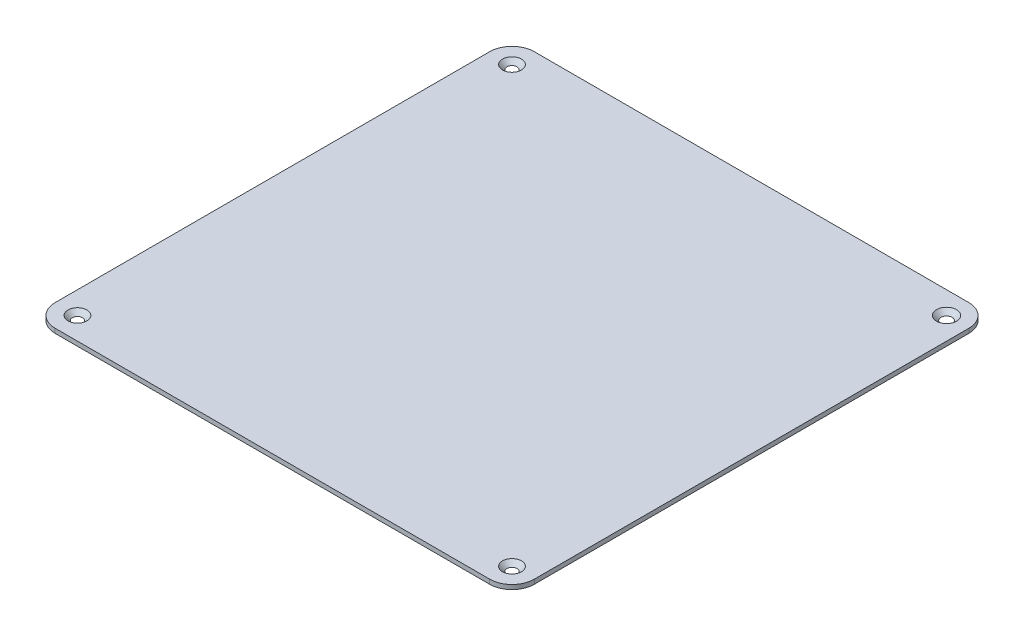
ISO-10303-21;
HEADER;
FILE_DESCRIPTION(('STEP AP214'),'2;1');
FILE_NAME('part.step','',(''),(''),'','','');
FILE_SCHEMA(('AUTOMOTIVE_DESIGN { 1 0 10303 214 1 1 1 1 }'));
ENDSEC;
DATA;
#1=APPLICATION_CONTEXT('core data for automotive mechanical design processes');
#2=APPLICATION_PROTOCOL_DEFINITION('international standard','automotive_design',2000,#1);
#3=PRODUCT_CONTEXT('',#1,'mechanical');
#4=PRODUCT('Part','Part','',(#3));
#5=PRODUCT_RELATED_PRODUCT_CATEGORY('part','',(#4));
#6=PRODUCT_DEFINITION_FORMATION('','',#4);
#7=PRODUCT_DEFINITION_CONTEXT('part definition',#1,'design');
#8=PRODUCT_DEFINITION('design','',#6,#7);
#9=PRODUCT_DEFINITION_SHAPE('','',#8);
#10=(LENGTH_UNIT() NAMED_UNIT(*) SI_UNIT(.MILLI.,.METRE.));
#11=(NAMED_UNIT(*) PLANE_ANGLE_UNIT() SI_UNIT($,.RADIAN.));
#12=(NAMED_UNIT(*) SI_UNIT($,.STERADIAN.) SOLID_ANGLE_UNIT());
#13=UNCERTAINTY_MEASURE_WITH_UNIT(LENGTH_MEASURE(1.E-05),#10,'distance_accuracy_value','');
#14=(GEOMETRIC_REPRESENTATION_CONTEXT(3) GLOBAL_UNCERTAINTY_ASSIGNED_CONTEXT((#13)) GLOBAL_UNIT_ASSIGNED_CONTEXT((#10,
#11,#12)) REPRESENTATION_CONTEXT('',''));
#15=CARTESIAN_POINT('',(0.,0.,0.));
#16=DIRECTION('',(0.,0.,1.));
#17=DIRECTION('',(1.,0.,0.));
#18=AXIS2_PLACEMENT_3D('',#15,#16,#17);
#19=CARTESIAN_POINT('',(-107.5,2.,-107.5));
#20=DIRECTION('',(1.,0.,0.));
#21=DIRECTION('',(0.,0.,-1.));
#22=AXIS2_PLACEMENT_3D('',#19,#20,#21);
#23=PLANE('',#22);
#24=DIRECTION('',(0.,0.,1.));
#25=VECTOR('',#24,1.);
#26=CARTESIAN_POINT('',(-107.5,2.,-107.5));
#27=LINE('',#26,#25);
#28=CARTESIAN_POINT('',(-107.5,2.,-97.4999999999999));
#29=VERTEX_POINT('',#28);
#30=CARTESIAN_POINT('',(-107.5,2.,97.4999999999999));
#31=VERTEX_POINT('',#30);
#32=EDGE_CURVE('E126',#29,#31,#27,.T.);
#33=ORIENTED_EDGE('',*,*,#32,.F.);
#34=DIRECTION('',(0.,-1.,0.));
#35=VECTOR('',#34,1.);
#36=CARTESIAN_POINT('',(-107.5,2.,-97.4999999999999));
#37=LINE('',#36,#35);
#38=CARTESIAN_POINT('',(-107.5,0.,-97.4999999999999));
#39=VERTEX_POINT('',#38);
#40=EDGE_CURVE('E164',#29,#39,#37,.T.);
#41=ORIENTED_EDGE('',*,*,#40,.T.);
#42=DIRECTION('',(0.,0.,1.));
#43=VECTOR('',#42,1.);
#44=CARTESIAN_POINT('',(-107.5,0.,-107.5));
#45=LINE('',#44,#43);
#46=CARTESIAN_POINT('',(-107.5,0.,97.4999999999999));
#47=VERTEX_POINT('',#46);
#48=EDGE_CURVE('E172',#39,#47,#45,.T.);
#49=ORIENTED_EDGE('',*,*,#48,.T.);
#50=DIRECTION('',(0.,-1.,0.));
#51=VECTOR('',#50,1.);
#52=CARTESIAN_POINT('',(-107.5,2.,97.5));
#53=LINE('',#52,#51);
#54=EDGE_CURVE('E162',#47,#31,#53,.F.);
#55=ORIENTED_EDGE('',*,*,#54,.T.);
#56=EDGE_LOOP('',(#33,#41,#49,#55));
#57=FACE_BOUND('',#56,.T.);
#58=ADVANCED_FACE('F35',(#57),#23,.F.);
#59=CARTESIAN_POINT('',(-107.5,2.,107.5));
#60=DIRECTION('',(0.,0.,-1.));
#61=DIRECTION('',(-1.,0.,0.));
#62=AXIS2_PLACEMENT_3D('',#59,#60,#61);
#63=PLANE('',#62);
#64=DIRECTION('',(1.,0.,0.));
#65=VECTOR('',#64,1.);
#66=CARTESIAN_POINT('',(-107.5,0.,107.5));
#67=LINE('',#66,#65);
#68=CARTESIAN_POINT('',(-97.5,0.,107.5));
#69=VERTEX_POINT('',#68);
#70=CARTESIAN_POINT('',(97.5,0.,107.5));
#71=VERTEX_POINT('',#70);
#72=EDGE_CURVE('E131',#69,#71,#67,.T.);
#73=ORIENTED_EDGE('',*,*,#72,.T.);
#74=DIRECTION('',(0.,-1.,0.));
#75=VECTOR('',#74,1.);
#76=CARTESIAN_POINT('',(97.5,2.,107.5));
#77=LINE('',#76,#75);
#78=CARTESIAN_POINT('',(97.5,2.,107.5));
#79=VERTEX_POINT('',#78);
#80=EDGE_CURVE('E11',#71,#79,#77,.F.);
#81=ORIENTED_EDGE('',*,*,#80,.T.);
#82=DIRECTION('',(1.,0.,0.));
#83=VECTOR('',#82,1.);
#84=CARTESIAN_POINT('',(-107.5,2.,107.5));
#85=LINE('',#84,#83);
#86=CARTESIAN_POINT('',(-97.5,2.,107.5));
#87=VERTEX_POINT('',#86);
#88=EDGE_CURVE('E129',#87,#79,#85,.T.);
#89=ORIENTED_EDGE('',*,*,#88,.F.);
#90=DIRECTION('',(0.,-1.,0.));
#91=VECTOR('',#90,1.);
#92=CARTESIAN_POINT('',(-97.5,2.,107.5));
#93=LINE('',#92,#91);
#94=EDGE_CURVE('E43',#87,#69,#93,.T.);
#95=ORIENTED_EDGE('',*,*,#94,.T.);
#96=EDGE_LOOP('',(#73,#81,#89,#95));
#97=FACE_BOUND('',#96,.T.);
#98=ADVANCED_FACE('F169',(#97),#63,.F.);
#99=CARTESIAN_POINT('',(107.5,2.,-107.5));
#100=DIRECTION('',(-1.,0.,0.));
#101=DIRECTION('',(0.,0.,1.));
#102=AXIS2_PLACEMENT_3D('',#99,#100,#101);
#103=PLANE('',#102);
#104=DIRECTION('',(0.,0.,-1.));
#105=VECTOR('',#104,1.);
#106=CARTESIAN_POINT('',(107.5,0.,-107.5));
#107=LINE('',#106,#105);
#108=CARTESIAN_POINT('',(107.5,0.,97.4999999999999));
#109=VERTEX_POINT('',#108);
#110=CARTESIAN_POINT('',(107.5,0.,-97.4999999999999));
#111=VERTEX_POINT('',#110);
#112=EDGE_CURVE('E127',#109,#111,#107,.T.);
#113=ORIENTED_EDGE('',*,*,#112,.T.);
#114=DIRECTION('',(0.,-1.,0.));
#115=VECTOR('',#114,1.);
#116=CARTESIAN_POINT('',(107.5,2.,-97.4999999999999));
#117=LINE('',#116,#115);
#118=CARTESIAN_POINT('',(107.5,2.,-97.4999999999999));
#119=VERTEX_POINT('',#118);
#120=EDGE_CURVE('E105',#111,#119,#117,.F.);
#121=ORIENTED_EDGE('',*,*,#120,.T.);
#122=DIRECTION('',(0.,0.,-1.));
#123=VECTOR('',#122,1.);
#124=CARTESIAN_POINT('',(107.5,2.,-107.5));
#125=LINE('',#124,#123);
#126=CARTESIAN_POINT('',(107.5,2.,97.4999999999999));
#127=VERTEX_POINT('',#126);
#128=EDGE_CURVE('E177',#127,#119,#125,.T.);
#129=ORIENTED_EDGE('',*,*,#128,.F.);
#130=DIRECTION('',(0.,-1.,0.));
#131=VECTOR('',#130,1.);
#132=CARTESIAN_POINT('',(107.5,2.,97.5));
#133=LINE('',#132,#131);
#134=EDGE_CURVE('E110',#127,#109,#133,.T.);
#135=ORIENTED_EDGE('',*,*,#134,.T.);
#136=EDGE_LOOP('',(#113,#121,#129,#135));
#137=FACE_BOUND('',#136,.T.);
#138=ADVANCED_FACE('F217',(#137),#103,.F.);
#139=CARTESIAN_POINT('',(-107.5,2.,-107.5));
#140=DIRECTION('',(0.,0.,1.));
#141=DIRECTION('',(1.,0.,0.));
#142=AXIS2_PLACEMENT_3D('',#139,#140,#141);
#143=PLANE('',#142);
#144=DIRECTION('',(-1.,0.,0.));
#145=VECTOR('',#144,1.);
#146=CARTESIAN_POINT('',(-107.5,2.,-107.5));
#147=LINE('',#146,#145);
#148=CARTESIAN_POINT('',(97.4999999999999,2.,-107.5));
#149=VERTEX_POINT('',#148);
#150=CARTESIAN_POINT('',(-97.4999999999999,2.,-107.5));
#151=VERTEX_POINT('',#150);
#152=EDGE_CURVE('E120',#149,#151,#147,.T.);
#153=ORIENTED_EDGE('',*,*,#152,.F.);
#154=DIRECTION('',(0.,-1.,0.));
#155=VECTOR('',#154,1.);
#156=CARTESIAN_POINT('',(97.5,2.,-107.5));
#157=LINE('',#156,#155);
#158=CARTESIAN_POINT('',(97.4999999999999,0.,-107.5));
#159=VERTEX_POINT('',#158);
#160=EDGE_CURVE('E104',#149,#159,#157,.T.);
#161=ORIENTED_EDGE('',*,*,#160,.T.);
#162=DIRECTION('',(-1.,0.,0.));
#163=VECTOR('',#162,1.);
#164=CARTESIAN_POINT('',(-107.5,0.,-107.5));
#165=LINE('',#164,#163);
#166=CARTESIAN_POINT('',(-97.4999999999999,0.,-107.5));
#167=VERTEX_POINT('',#166);
#168=EDGE_CURVE('E117',#159,#167,#165,.T.);
#169=ORIENTED_EDGE('',*,*,#168,.T.);
#170=DIRECTION('',(0.,-1.,0.));
#171=VECTOR('',#170,1.);
#172=CARTESIAN_POINT('',(-97.4999999999999,2.,-107.5));
#173=LINE('',#172,#171);
#174=EDGE_CURVE('E122',#167,#151,#173,.F.);
#175=ORIENTED_EDGE('',*,*,#174,.T.);
#176=EDGE_LOOP('',(#153,#161,#169,#175));
#177=FACE_BOUND('',#176,.T.);
#178=ADVANCED_FACE('F116',(#177),#143,.F.);
#179=CARTESIAN_POINT('',(0.,2.,0.));
#180=DIRECTION('',(0.,1.,0.));
#181=DIRECTION('',(0.,0.,1.));
#182=AXIS2_PLACEMENT_3D('',#179,#180,#181);
#183=PLANE('',#182);
#184=CARTESIAN_POINT('',(97.5,2.,97.4999999999999));
#185=DIRECTION('',(0.,1.,0.));
#186=DIRECTION('',(0.,0.,1.));
#187=AXIS2_PLACEMENT_3D('',#184,#185,#186);
#188=CIRCLE('',#187,4.25);
#189=CARTESIAN_POINT('',(97.5,2.,101.75));
#190=VERTEX_POINT('',#189);
#191=EDGE_CURVE('E144',#190,#190,#188,.F.);
#192=ORIENTED_EDGE('',*,*,#191,.T.);
#193=EDGE_LOOP('',(#192));
#194=FACE_BOUND('',#193,.T.);
#195=CARTESIAN_POINT('',(-97.4999999999999,2.,97.5));
#196=DIRECTION('',(0.,1.,0.));
#197=DIRECTION('',(0.,0.,1.));
#198=AXIS2_PLACEMENT_3D('',#195,#196,#197);
#199=CIRCLE('',#198,4.25);
#200=CARTESIAN_POINT('',(-97.4999999999999,2.,101.75));
#201=VERTEX_POINT('',#200);
#202=EDGE_CURVE('E141',#201,#201,#199,.F.);
#203=ORIENTED_EDGE('',*,*,#202,.T.);
#204=EDGE_LOOP('',(#203));
#205=FACE_BOUND('',#204,.T.);
#206=CARTESIAN_POINT('',(97.5,2.,-97.5));
#207=DIRECTION('',(0.,1.,0.));
#208=DIRECTION('',(0.,0.,1.));
#209=AXIS2_PLACEMENT_3D('',#206,#207,#208);
#210=CIRCLE('',#209,4.5);
#211=CARTESIAN_POINT('',(97.5,2.,-93.));
#212=VERTEX_POINT('',#211);
#213=EDGE_CURVE('E138',#212,#212,#210,.F.);
#214=ORIENTED_EDGE('',*,*,#213,.T.);
#215=EDGE_LOOP('',(#214));
#216=FACE_BOUND('',#215,.T.);
#217=CARTESIAN_POINT('',(-97.4999999999999,2.,-97.5));
#218=DIRECTION('',(0.,1.,0.));
#219=DIRECTION('',(0.,0.,1.));
#220=AXIS2_PLACEMENT_3D('',#217,#218,#219);
#221=CIRCLE('',#220,4.25);
#222=CARTESIAN_POINT('',(-97.4999999999999,2.,-93.25));
#223=VERTEX_POINT('',#222);
#224=EDGE_CURVE('E135',#223,#223,#221,.F.);
#225=ORIENTED_EDGE('',*,*,#224,.T.);
#226=EDGE_LOOP('',(#225));
#227=FACE_BOUND('',#226,.T.);
#228=ORIENTED_EDGE('',*,*,#128,.T.);
#229=CARTESIAN_POINT('',(97.5,2.,-97.4999999999999));
#230=DIRECTION('',(0.,1.,0.));
#231=DIRECTION('',(0.,0.,1.));
#232=AXIS2_PLACEMENT_3D('',#229,#230,#231);
#233=CIRCLE('',#232,10.);
#234=EDGE_CURVE('E160',#119,#149,#233,.T.);
#235=ORIENTED_EDGE('',*,*,#234,.T.);
#236=ORIENTED_EDGE('',*,*,#152,.T.);
#237=CARTESIAN_POINT('',(-97.4999999999999,2.,-97.4999999999999));
#238=DIRECTION('',(0.,1.,0.));
#239=DIRECTION('',(0.,0.,1.));
#240=AXIS2_PLACEMENT_3D('',#237,#238,#239);
#241=CIRCLE('',#240,10.);
#242=EDGE_CURVE('E158',#151,#29,#241,.T.);
#243=ORIENTED_EDGE('',*,*,#242,.T.);
#244=ORIENTED_EDGE('',*,*,#32,.T.);
#245=CARTESIAN_POINT('',(-97.5,2.,97.4999999999999));
#246=DIRECTION('',(0.,1.,0.));
#247=DIRECTION('',(0.,0.,1.));
#248=AXIS2_PLACEMENT_3D('',#245,#246,#247);
#249=CIRCLE('',#248,10.);
#250=EDGE_CURVE('E55',#31,#87,#249,.T.);
#251=ORIENTED_EDGE('',*,*,#250,.T.);
#252=ORIENTED_EDGE('',*,*,#88,.T.);
#253=CARTESIAN_POINT('',(97.5,2.,97.5));
#254=DIRECTION('',(0.,1.,0.));
#255=DIRECTION('',(0.,0.,1.));
#256=AXIS2_PLACEMENT_3D('',#253,#254,#255);
#257=CIRCLE('',#256,10.);
#258=EDGE_CURVE('E156',#79,#127,#257,.T.);
#259=ORIENTED_EDGE('',*,*,#258,.T.);
#260=EDGE_LOOP('',(#228,#235,#236,#243,#244,#251,#252,#259));
#261=FACE_BOUND('',#260,.T.);
#262=ADVANCED_FACE('F227',(#194,#205,#216,#227,#261),#183,.T.);
#263=CARTESIAN_POINT('',(0.,0.,0.));
#264=DIRECTION('',(0.,1.,0.));
#265=DIRECTION('',(0.,0.,1.));
#266=AXIS2_PLACEMENT_3D('',#263,#264,#265);
#267=PLANE('',#266);
#268=CARTESIAN_POINT('',(97.5,0.,-97.5));
#269=DIRECTION('',(0.,1.,0.));
#270=DIRECTION('',(0.,0.,1.));
#271=AXIS2_PLACEMENT_3D('',#268,#269,#270);
#272=CIRCLE('',#271,2.5);
#273=CARTESIAN_POINT('',(97.5,0.,-95.));
#274=VERTEX_POINT('',#273);
#275=EDGE_CURVE('E189',#274,#274,#272,.T.);
#276=ORIENTED_EDGE('',*,*,#275,.T.);
#277=EDGE_LOOP('',(#276));
#278=FACE_BOUND('',#277,.T.);
#279=CARTESIAN_POINT('',(97.5,0.,97.4999999999999));
#280=DIRECTION('',(0.,1.,0.));
#281=DIRECTION('',(0.,0.,1.));
#282=AXIS2_PLACEMENT_3D('',#279,#280,#281);
#283=CIRCLE('',#282,2.25);
#284=CARTESIAN_POINT('',(97.5,0.,99.7499999999999));
#285=VERTEX_POINT('',#284);
#286=EDGE_CURVE('E186',#285,#285,#283,.T.);
#287=ORIENTED_EDGE('',*,*,#286,.T.);
#288=EDGE_LOOP('',(#287));
#289=FACE_BOUND('',#288,.T.);
#290=CARTESIAN_POINT('',(-97.4999999999999,0.,97.5));
#291=DIRECTION('',(0.,1.,0.));
#292=DIRECTION('',(0.,0.,1.));
#293=AXIS2_PLACEMENT_3D('',#290,#291,#292);
#294=CIRCLE('',#293,2.25);
#295=CARTESIAN_POINT('',(-97.4999999999999,0.,99.75));
#296=VERTEX_POINT('',#295);
#297=EDGE_CURVE('E183',#296,#296,#294,.T.);
#298=ORIENTED_EDGE('',*,*,#297,.T.);
#299=EDGE_LOOP('',(#298));
#300=FACE_BOUND('',#299,.T.);
#301=CARTESIAN_POINT('',(-97.4999999999999,0.,-97.5));
#302=DIRECTION('',(0.,1.,0.));
#303=DIRECTION('',(0.,0.,1.));
#304=AXIS2_PLACEMENT_3D('',#301,#302,#303);
#305=CIRCLE('',#304,2.25);
#306=CARTESIAN_POINT('',(-97.4999999999999,0.,-95.25));
#307=VERTEX_POINT('',#306);
#308=EDGE_CURVE('E173',#307,#307,#305,.T.);
#309=ORIENTED_EDGE('',*,*,#308,.T.);
#310=EDGE_LOOP('',(#309));
#311=FACE_BOUND('',#310,.T.);
#312=ORIENTED_EDGE('',*,*,#168,.F.);
#313=CARTESIAN_POINT('',(97.5,0.,-97.4999999999999));
#314=DIRECTION('',(0.,1.,0.));
#315=DIRECTION('',(0.,0.,1.));
#316=AXIS2_PLACEMENT_3D('',#313,#314,#315);
#317=CIRCLE('',#316,10.);
#318=EDGE_CURVE('E100',#159,#111,#317,.F.);
#319=ORIENTED_EDGE('',*,*,#318,.T.);
#320=ORIENTED_EDGE('',*,*,#112,.F.);
#321=CARTESIAN_POINT('',(97.5,0.,97.5));
#322=DIRECTION('',(0.,1.,0.));
#323=DIRECTION('',(0.,0.,1.));
#324=AXIS2_PLACEMENT_3D('',#321,#322,#323);
#325=CIRCLE('',#324,10.);
#326=EDGE_CURVE('E149',#109,#71,#325,.F.);
#327=ORIENTED_EDGE('',*,*,#326,.T.);
#328=ORIENTED_EDGE('',*,*,#72,.F.);
#329=CARTESIAN_POINT('',(-97.5,0.,97.4999999999999));
#330=DIRECTION('',(0.,1.,0.));
#331=DIRECTION('',(0.,0.,1.));
#332=AXIS2_PLACEMENT_3D('',#329,#330,#331);
#333=CIRCLE('',#332,10.);
#334=EDGE_CURVE('E121',#69,#47,#333,.F.);
#335=ORIENTED_EDGE('',*,*,#334,.T.);
#336=ORIENTED_EDGE('',*,*,#48,.F.);
#337=CARTESIAN_POINT('',(-97.4999999999999,0.,-97.4999999999999));
#338=DIRECTION('',(0.,1.,0.));
#339=DIRECTION('',(0.,0.,1.));
#340=AXIS2_PLACEMENT_3D('',#337,#338,#339);
#341=CIRCLE('',#340,10.);
#342=EDGE_CURVE('E111',#39,#167,#341,.F.);
#343=ORIENTED_EDGE('',*,*,#342,.T.);
#344=EDGE_LOOP('',(#312,#319,#320,#327,#328,#335,#336,#343));
#345=FACE_BOUND('',#344,.T.);
#346=ADVANCED_FACE('F124',(#278,#289,#300,#311,#345),#267,.F.);
#347=CARTESIAN_POINT('',(97.5,0.,97.4999999999999));
#348=DIRECTION('',(0.,1.,0.));
#349=DIRECTION('',(0.,0.,1.));
#350=AXIS2_PLACEMENT_3D('',#347,#348,#349);
#351=CONICAL_SURFACE('',#350,2.25,0.785398163397446);
#352=ORIENTED_EDGE('',*,*,#191,.F.);
#353=EDGE_LOOP('',(#352));
#354=FACE_BOUND('',#353,.T.);
#355=ORIENTED_EDGE('',*,*,#286,.F.);
#356=EDGE_LOOP('',(#355));
#357=FACE_BOUND('',#356,.T.);
#358=ADVANCED_FACE('F207',(#354,#357),#351,.F.);
#359=CARTESIAN_POINT('',(-97.4999999999999,0.,97.5));
#360=DIRECTION('',(0.,1.,0.));
#361=DIRECTION('',(0.,0.,1.));
#362=AXIS2_PLACEMENT_3D('',#359,#360,#361);
#363=CONICAL_SURFACE('',#362,2.25,0.785398163397446);
#364=ORIENTED_EDGE('',*,*,#202,.F.);
#365=EDGE_LOOP('',(#364));
#366=FACE_BOUND('',#365,.T.);
#367=ORIENTED_EDGE('',*,*,#297,.F.);
#368=EDGE_LOOP('',(#367));
#369=FACE_BOUND('',#368,.T.);
#370=ADVANCED_FACE('F198',(#366,#369),#363,.F.);
#371=CARTESIAN_POINT('',(97.5,0.,-97.5));
#372=DIRECTION('',(0.,1.,0.));
#373=DIRECTION('',(0.,0.,1.));
#374=AXIS2_PLACEMENT_3D('',#371,#372,#373);
#375=CONICAL_SURFACE('',#374,2.5,0.785398163397446);
#376=ORIENTED_EDGE('',*,*,#213,.F.);
#377=EDGE_LOOP('',(#376));
#378=FACE_BOUND('',#377,.T.);
#379=ORIENTED_EDGE('',*,*,#275,.F.);
#380=EDGE_LOOP('',(#379));
#381=FACE_BOUND('',#380,.T.);
#382=ADVANCED_FACE('F195',(#378,#381),#375,.F.);
#383=CARTESIAN_POINT('',(-97.4999999999999,0.,-97.5));
#384=DIRECTION('',(0.,1.,0.));
#385=DIRECTION('',(0.,0.,1.));
#386=AXIS2_PLACEMENT_3D('',#383,#384,#385);
#387=CONICAL_SURFACE('',#386,2.25,0.785398163397446);
#388=ORIENTED_EDGE('',*,*,#224,.F.);
#389=EDGE_LOOP('',(#388));
#390=FACE_BOUND('',#389,.T.);
#391=ORIENTED_EDGE('',*,*,#308,.F.);
#392=EDGE_LOOP('',(#391));
#393=FACE_BOUND('',#392,.T.);
#394=ADVANCED_FACE('F197',(#390,#393),#387,.F.);
#395=CARTESIAN_POINT('',(97.5,2.,-97.4999999999999));
#396=DIRECTION('',(0.,-1.,0.));
#397=DIRECTION('',(0.,0.,-1.));
#398=AXIS2_PLACEMENT_3D('',#395,#396,#397);
#399=CYLINDRICAL_SURFACE('',#398,10.);
#400=ORIENTED_EDGE('',*,*,#234,.F.);
#401=ORIENTED_EDGE('',*,*,#120,.F.);
#402=ORIENTED_EDGE('',*,*,#318,.F.);
#403=ORIENTED_EDGE('',*,*,#160,.F.);
#404=EDGE_LOOP('',(#400,#401,#402,#403));
#405=FACE_BOUND('',#404,.T.);
#406=ADVANCED_FACE('F103',(#405),#399,.T.);
#407=CARTESIAN_POINT('',(-97.4999999999999,2.,-97.4999999999999));
#408=DIRECTION('',(0.,-1.,0.));
#409=DIRECTION('',(0.,0.,-1.));
#410=AXIS2_PLACEMENT_3D('',#407,#408,#409);
#411=CYLINDRICAL_SURFACE('',#410,10.);
#412=ORIENTED_EDGE('',*,*,#242,.F.);
#413=ORIENTED_EDGE('',*,*,#174,.F.);
#414=ORIENTED_EDGE('',*,*,#342,.F.);
#415=ORIENTED_EDGE('',*,*,#40,.F.);
#416=EDGE_LOOP('',(#412,#413,#414,#415));
#417=FACE_BOUND('',#416,.T.);
#418=ADVANCED_FACE('F253',(#417),#411,.T.);
#419=CARTESIAN_POINT('',(97.5,2.,97.5));
#420=DIRECTION('',(0.,-1.,0.));
#421=DIRECTION('',(0.,0.,-1.));
#422=AXIS2_PLACEMENT_3D('',#419,#420,#421);
#423=CYLINDRICAL_SURFACE('',#422,10.);
#424=ORIENTED_EDGE('',*,*,#258,.F.);
#425=ORIENTED_EDGE('',*,*,#80,.F.);
#426=ORIENTED_EDGE('',*,*,#326,.F.);
#427=ORIENTED_EDGE('',*,*,#134,.F.);
#428=EDGE_LOOP('',(#424,#425,#426,#427));
#429=FACE_BOUND('',#428,.T.);
#430=ADVANCED_FACE('F251',(#429),#423,.T.);
#431=CARTESIAN_POINT('',(-97.5,2.,97.4999999999999));
#432=DIRECTION('',(0.,-1.,0.));
#433=DIRECTION('',(0.,0.,-1.));
#434=AXIS2_PLACEMENT_3D('',#431,#432,#433);
#435=CYLINDRICAL_SURFACE('',#434,10.);
#436=ORIENTED_EDGE('',*,*,#250,.F.);
#437=ORIENTED_EDGE('',*,*,#54,.F.);
#438=ORIENTED_EDGE('',*,*,#334,.F.);
#439=ORIENTED_EDGE('',*,*,#94,.F.);
#440=EDGE_LOOP('',(#436,#437,#438,#439));
#441=FACE_BOUND('',#440,.T.);
#442=ADVANCED_FACE('F37',(#441),#435,.T.);
#443=CLOSED_SHELL('',(#58,#98,#138,#178,#262,#346,#358,#370,#382,#394,#406,#418,#430,#442));
#444=MANIFOLD_SOLID_BREP('B2',#443);
#445=ADVANCED_BREP_SHAPE_REPRESENTATION('',(#18,#444),#14);
#446=SHAPE_DEFINITION_REPRESENTATION(#9,#445);
ENDSEC;
END-ISO-10303-21;
